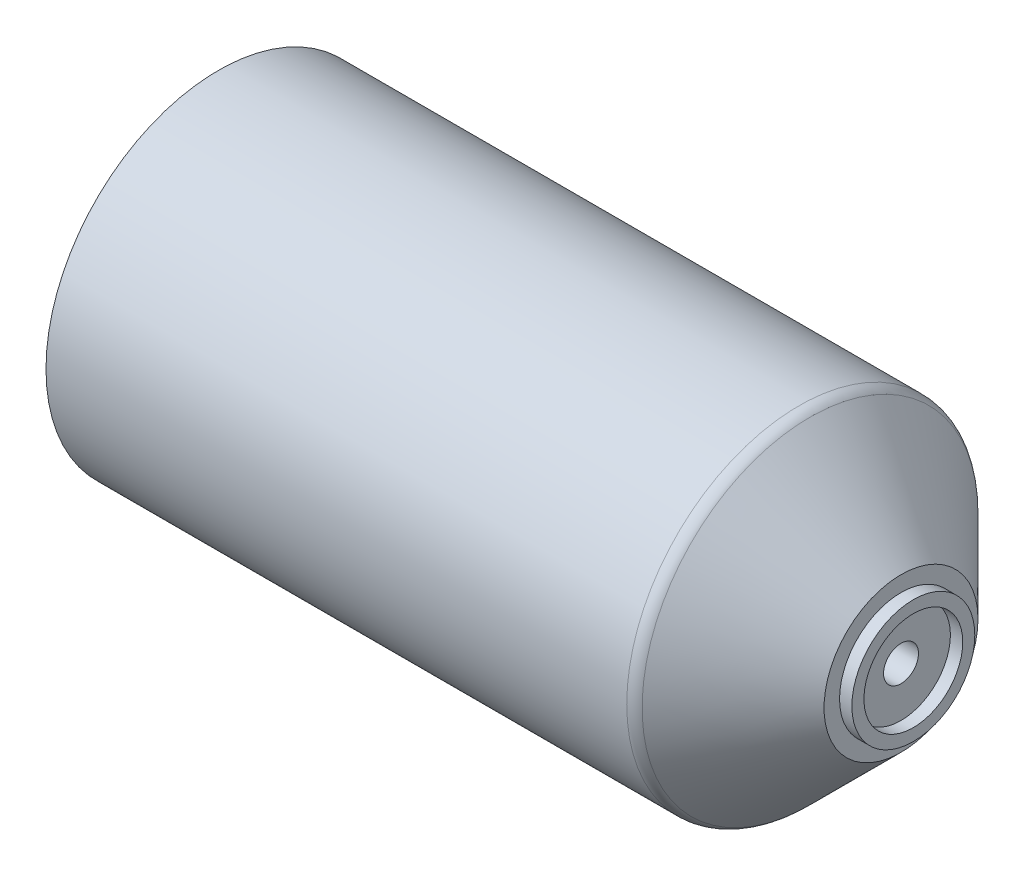
ISO-10303-21;
HEADER;
FILE_DESCRIPTION(('STEP AP214'),'2;1');
FILE_NAME('part.step','',(''),(''),'','','');
FILE_SCHEMA(('AUTOMOTIVE_DESIGN { 1 0 10303 214 1 1 1 1 }'));
ENDSEC;
DATA;
#1=APPLICATION_CONTEXT('core data for automotive mechanical design processes');
#2=APPLICATION_PROTOCOL_DEFINITION('international standard','automotive_design',2000,#1);
#3=PRODUCT_CONTEXT('',#1,'mechanical');
#4=PRODUCT('Part','Part','',(#3));
#5=PRODUCT_RELATED_PRODUCT_CATEGORY('part','',(#4));
#6=PRODUCT_DEFINITION_FORMATION('','',#4);
#7=PRODUCT_DEFINITION_CONTEXT('part definition',#1,'design');
#8=PRODUCT_DEFINITION('design','',#6,#7);
#9=PRODUCT_DEFINITION_SHAPE('','',#8);
#10=(LENGTH_UNIT() NAMED_UNIT(*) SI_UNIT(.MILLI.,.METRE.));
#11=(NAMED_UNIT(*) PLANE_ANGLE_UNIT() SI_UNIT($,.RADIAN.));
#12=(NAMED_UNIT(*) SI_UNIT($,.STERADIAN.) SOLID_ANGLE_UNIT());
#13=UNCERTAINTY_MEASURE_WITH_UNIT(LENGTH_MEASURE(1.E-05),#10,'distance_accuracy_value','');
#14=(GEOMETRIC_REPRESENTATION_CONTEXT(3) GLOBAL_UNCERTAINTY_ASSIGNED_CONTEXT((#13)) GLOBAL_UNIT_ASSIGNED_CONTEXT((#10,
#11,#12)) REPRESENTATION_CONTEXT('',''));
#15=CARTESIAN_POINT('',(0.,0.,0.));
#16=DIRECTION('',(0.,0.,1.));
#17=DIRECTION('',(1.,0.,0.));
#18=AXIS2_PLACEMENT_3D('',#15,#16,#17);
#19=CARTESIAN_POINT('',(-5.82137303331799,0.,0.));
#20=DIRECTION('',(-1.,0.,0.));
#21=DIRECTION('',(0.,0.,1.));
#22=AXIS2_PLACEMENT_3D('',#19,#20,#21);
#23=PLANE('',#22);
#24=CARTESIAN_POINT('',(-5.82137303331799,0.,0.));
#25=DIRECTION('',(-1.,0.,0.));
#26=DIRECTION('',(0.,0.,1.));
#27=AXIS2_PLACEMENT_3D('',#24,#25,#26);
#28=CIRCLE('',#27,1.8);
#29=CARTESIAN_POINT('',(-5.82137303331799,0.,1.8));
#30=VERTEX_POINT('',#29);
#31=EDGE_CURVE('E50',#30,#30,#28,.F.);
#32=ORIENTED_EDGE('',*,*,#31,.F.);
#33=EDGE_LOOP('',(#32));
#34=FACE_BOUND('',#33,.T.);
#35=CARTESIAN_POINT('',(-5.82137303331799,0.,0.));
#36=DIRECTION('',(1.,0.,0.));
#37=DIRECTION('',(0.,0.,-1.));
#38=AXIS2_PLACEMENT_3D('',#35,#36,#37);
#39=CIRCLE('',#38,5.0927);
#40=CARTESIAN_POINT('',(-5.82137303331799,0.,-5.0927));
#41=VERTEX_POINT('',#40);
#42=EDGE_CURVE('E105',#41,#41,#39,.T.);
#43=ORIENTED_EDGE('',*,*,#42,.T.);
#44=EDGE_LOOP('',(#43));
#45=FACE_BOUND('',#44,.T.);
#46=ADVANCED_FACE('F37',(#34,#45),#23,.F.);
#47=CARTESIAN_POINT('',(-5.82137303331799,0.,0.));
#48=DIRECTION('',(-1.,0.,0.));
#49=DIRECTION('',(0.,0.,1.));
#50=AXIS2_PLACEMENT_3D('',#47,#48,#49);
#51=CIRCLE('',#50,6.3373);
#52=CARTESIAN_POINT('',(-5.82137303331799,0.,6.3373));
#53=VERTEX_POINT('',#52);
#54=EDGE_CURVE('E10',#53,#53,#51,.F.);
#55=ORIENTED_EDGE('',*,*,#54,.F.);
#56=EDGE_LOOP('',(#55));
#57=FACE_BOUND('',#56,.T.);
#58=CARTESIAN_POINT('',(-5.82137303331799,0.,0.));
#59=DIRECTION('',(1.,0.,0.));
#60=DIRECTION('',(0.,0.,-1.));
#61=AXIS2_PLACEMENT_3D('',#58,#59,#60);
#62=CIRCLE('',#61,7.9375);
#63=CARTESIAN_POINT('',(-5.82137303331799,0.,-7.9375));
#64=VERTEX_POINT('',#63);
#65=EDGE_CURVE('E45',#64,#64,#62,.T.);
#66=ORIENTED_EDGE('',*,*,#65,.T.);
#67=EDGE_LOOP('',(#66));
#68=FACE_BOUND('',#67,.T.);
#69=ADVANCED_FACE('F39',(#57,#68),#23,.F.);
#70=CARTESIAN_POINT('',(-15.6638730333181,0.,0.));
#71=DIRECTION('',(-1.,0.,0.));
#72=DIRECTION('',(0.,0.,1.));
#73=AXIS2_PLACEMENT_3D('',#70,#71,#72);
#74=CYLINDRICAL_SURFACE('',#73,1.8);
#75=ORIENTED_EDGE('',*,*,#31,.T.);
#76=EDGE_LOOP('',(#75));
#77=FACE_BOUND('',#76,.T.);
#78=CARTESIAN_POINT('',(-14.0138730333181,0.,0.));
#79=DIRECTION('',(-1.,0.,0.));
#80=DIRECTION('',(0.,0.,1.));
#81=AXIS2_PLACEMENT_3D('',#78,#79,#80);
#82=CIRCLE('',#81,1.8);
#83=CARTESIAN_POINT('',(-14.0138730333181,0.,1.8));
#84=VERTEX_POINT('',#83);
#85=EDGE_CURVE('E129',#84,#84,#82,.T.);
#86=ORIENTED_EDGE('',*,*,#85,.T.);
#87=EDGE_LOOP('',(#86));
#88=FACE_BOUND('',#87,.T.);
#89=ADVANCED_FACE('F82',(#77,#88),#74,.F.);
#90=CARTESIAN_POINT('',(24.17211464598,0.,0.));
#91=DIRECTION('',(1.,0.,0.));
#92=DIRECTION('',(0.,0.,-1.));
#93=AXIS2_PLACEMENT_3D('',#90,#91,#92);
#94=CYLINDRICAL_SURFACE('',#93,11.43);
#95=CARTESIAN_POINT('',(-15.6638730333181,0.,0.));
#96=DIRECTION('',(1.,0.,0.));
#97=DIRECTION('',(0.,0.,-1.));
#98=AXIS2_PLACEMENT_3D('',#95,#96,#97);
#99=CIRCLE('',#98,11.43);
#100=CARTESIAN_POINT('',(-15.6638730333181,0.,-11.43));
#101=VERTEX_POINT('',#100);
#102=EDGE_CURVE('E59',#101,#101,#99,.T.);
#103=ORIENTED_EDGE('',*,*,#102,.T.);
#104=EDGE_LOOP('',(#103));
#105=FACE_BOUND('',#104,.T.);
#106=CARTESIAN_POINT('',(-76.2,0.,0.));
#107=DIRECTION('',(1.,0.,0.));
#108=DIRECTION('',(0.,0.,-1.));
#109=AXIS2_PLACEMENT_3D('',#106,#107,#108);
#110=CIRCLE('',#109,11.43);
#111=CARTESIAN_POINT('',(-76.2,0.,-11.43));
#112=VERTEX_POINT('',#111);
#113=EDGE_CURVE('E56',#112,#112,#110,.T.);
#114=ORIENTED_EDGE('',*,*,#113,.F.);
#115=EDGE_LOOP('',(#114));
#116=FACE_BOUND('',#115,.T.);
#117=ADVANCED_FACE('F80',(#105,#116),#94,.F.);
#118=CARTESIAN_POINT('',(-76.2,17.78,0.));
#119=DIRECTION('',(-1.,0.,0.));
#120=DIRECTION('',(0.,0.,1.));
#121=AXIS2_PLACEMENT_3D('',#118,#119,#120);
#122=PLANE('',#121);
#123=ORIENTED_EDGE('',*,*,#113,.T.);
#124=EDGE_LOOP('',(#123));
#125=FACE_BOUND('',#124,.T.);
#126=CARTESIAN_POINT('',(-76.2,0.,0.));
#127=DIRECTION('',(1.,0.,0.));
#128=DIRECTION('',(0.,0.,-1.));
#129=AXIS2_PLACEMENT_3D('',#126,#127,#128);
#130=CIRCLE('',#129,17.78);
#131=CARTESIAN_POINT('',(-76.2,0.,-17.78));
#132=VERTEX_POINT('',#131);
#133=EDGE_CURVE('E69',#132,#132,#130,.T.);
#134=ORIENTED_EDGE('',*,*,#133,.F.);
#135=EDGE_LOOP('',(#134));
#136=FACE_BOUND('',#135,.T.);
#137=ADVANCED_FACE('F77',(#125,#136),#122,.T.);
#138=CARTESIAN_POINT('',(24.17211464598,0.,0.));
#139=DIRECTION('',(1.,0.,0.));
#140=DIRECTION('',(0.,0.,-1.));
#141=AXIS2_PLACEMENT_3D('',#138,#139,#140);
#142=CYLINDRICAL_SURFACE('',#141,17.78);
#143=ORIENTED_EDGE('',*,*,#133,.T.);
#144=EDGE_LOOP('',(#143));
#145=FACE_BOUND('',#144,.T.);
#146=CARTESIAN_POINT('',(-16.3214370635854,0.,0.));
#147=DIRECTION('',(1.,0.,0.));
#148=DIRECTION('',(0.,0.,-1.));
#149=AXIS2_PLACEMENT_3D('',#146,#147,#148);
#150=CIRCLE('',#149,17.78);
#151=CARTESIAN_POINT('',(-16.3214370635854,0.,-17.78));
#152=VERTEX_POINT('',#151);
#153=EDGE_CURVE('E65',#152,#152,#150,.T.);
#154=ORIENTED_EDGE('',*,*,#153,.F.);
#155=EDGE_LOOP('',(#154));
#156=FACE_BOUND('',#155,.T.);
#157=ADVANCED_FACE('F88',(#145,#156),#142,.T.);
#158=CARTESIAN_POINT('',(-16.3214370635854,0.,0.));
#159=DIRECTION('',(1.,0.,0.));
#160=DIRECTION('',(0.,0.,-1.));
#161=AXIS2_PLACEMENT_3D('',#158,#159,#160);
#162=TOROIDAL_SURFACE('',#161,16.1925,1.58749999999999);
#163=ORIENTED_EDGE('',*,*,#153,.T.);
#164=EDGE_LOOP('',(#163));
#165=FACE_BOUND('',#164,.T.);
#166=CARTESIAN_POINT('',(-15.1989050484517,0.,0.));
#167=DIRECTION('',(1.,0.,0.));
#168=DIRECTION('',(0.,0.,-1.));
#169=AXIS2_PLACEMENT_3D('',#166,#167,#168);
#170=CIRCLE('',#169,17.3150320151336);
#171=CARTESIAN_POINT('',(-15.1989050484517,0.,-17.3150320151336));
#172=VERTEX_POINT('',#171);
#173=EDGE_CURVE('E61',#172,#172,#170,.T.);
#174=ORIENTED_EDGE('',*,*,#173,.F.);
#175=EDGE_LOOP('',(#174));
#176=FACE_BOUND('',#175,.T.);
#177=ADVANCED_FACE('F150',(#165,#176),#162,.T.);
#178=CARTESIAN_POINT('',(-5.82137303331799,0.,0.));
#179=DIRECTION('',(-1.,0.,0.));
#180=DIRECTION('',(0.,0.,1.));
#181=AXIS2_PLACEMENT_3D('',#178,#179,#180);
#182=CONICAL_SURFACE('',#181,7.9375,0.785398163397442);
#183=ORIENTED_EDGE('',*,*,#173,.T.);
#184=EDGE_LOOP('',(#183));
#185=FACE_BOUND('',#184,.T.);
#186=ORIENTED_EDGE('',*,*,#65,.F.);
#187=EDGE_LOOP('',(#186));
#188=FACE_BOUND('',#187,.T.);
#189=ADVANCED_FACE('F140',(#185,#188),#182,.T.);
#190=CARTESIAN_POINT('',(-15.6638730333181,11.43,0.));
#191=DIRECTION('',(-1.,0.,0.));
#192=DIRECTION('',(0.,0.,1.));
#193=AXIS2_PLACEMENT_3D('',#190,#191,#192);
#194=PLANE('',#193);
#195=CARTESIAN_POINT('',(-15.6638730333181,0.,0.));
#196=DIRECTION('',(-1.,0.,0.));
#197=DIRECTION('',(0.,0.,1.));
#198=AXIS2_PLACEMENT_3D('',#195,#196,#197);
#199=CIRCLE('',#198,3.375);
#200=CARTESIAN_POINT('',(-15.6638730333181,0.,3.375));
#201=VERTEX_POINT('',#200);
#202=EDGE_CURVE('E118',#201,#201,#199,.T.);
#203=ORIENTED_EDGE('',*,*,#202,.F.);
#204=EDGE_LOOP('',(#203));
#205=FACE_BOUND('',#204,.T.);
#206=ORIENTED_EDGE('',*,*,#102,.F.);
#207=EDGE_LOOP('',(#206));
#208=FACE_BOUND('',#207,.T.);
#209=ADVANCED_FACE('F137',(#205,#208),#194,.T.);
#210=CARTESIAN_POINT('',(-14.0138730333181,3.35,0.));
#211=DIRECTION('',(1.,0.,0.));
#212=DIRECTION('',(0.,0.,-1.));
#213=AXIS2_PLACEMENT_3D('',#210,#211,#212);
#214=PLANE('',#213);
#215=ORIENTED_EDGE('',*,*,#85,.F.);
#216=EDGE_LOOP('',(#215));
#217=FACE_BOUND('',#216,.T.);
#218=CARTESIAN_POINT('',(-14.0138730333181,0.,0.));
#219=DIRECTION('',(-1.,0.,0.));
#220=DIRECTION('',(0.,0.,1.));
#221=AXIS2_PLACEMENT_3D('',#218,#219,#220);
#222=CIRCLE('',#221,3.35);
#223=CARTESIAN_POINT('',(-14.0138730333181,0.,3.35));
#224=VERTEX_POINT('',#223);
#225=EDGE_CURVE('E126',#224,#224,#222,.T.);
#226=ORIENTED_EDGE('',*,*,#225,.T.);
#227=EDGE_LOOP('',(#226));
#228=FACE_BOUND('',#227,.T.);
#229=ADVANCED_FACE('F139',(#217,#228),#214,.F.);
#230=CARTESIAN_POINT('',(-15.6638730333181,0.,0.));
#231=DIRECTION('',(-1.,0.,0.));
#232=DIRECTION('',(0.,0.,1.));
#233=AXIS2_PLACEMENT_3D('',#230,#231,#232);
#234=CYLINDRICAL_SURFACE('',#233,3.35);
#235=ORIENTED_EDGE('',*,*,#225,.F.);
#236=EDGE_LOOP('',(#235));
#237=FACE_BOUND('',#236,.T.);
#238=CARTESIAN_POINT('',(-15.6388730333181,0.,0.));
#239=DIRECTION('',(-1.,0.,0.));
#240=DIRECTION('',(0.,0.,1.));
#241=AXIS2_PLACEMENT_3D('',#238,#239,#240);
#242=CIRCLE('',#241,3.35);
#243=CARTESIAN_POINT('',(-15.6388730333181,0.,3.35));
#244=VERTEX_POINT('',#243);
#245=EDGE_CURVE('E122',#244,#244,#242,.T.);
#246=ORIENTED_EDGE('',*,*,#245,.T.);
#247=EDGE_LOOP('',(#246));
#248=FACE_BOUND('',#247,.T.);
#249=ADVANCED_FACE('F147',(#237,#248),#234,.F.);
#250=CARTESIAN_POINT('',(-15.6638730333181,0.,0.));
#251=DIRECTION('',(-1.,0.,0.));
#252=DIRECTION('',(0.,0.,1.));
#253=AXIS2_PLACEMENT_3D('',#250,#251,#252);
#254=CONICAL_SURFACE('',#253,3.375,0.785398163397405);
#255=ORIENTED_EDGE('',*,*,#245,.F.);
#256=EDGE_LOOP('',(#255));
#257=FACE_BOUND('',#256,.T.);
#258=ORIENTED_EDGE('',*,*,#202,.T.);
#259=EDGE_LOOP('',(#258));
#260=FACE_BOUND('',#259,.T.);
#261=ADVANCED_FACE('F100',(#257,#260),#254,.F.);
#262=CARTESIAN_POINT('',(-4.55137303331799,0.,0.));
#263=DIRECTION('',(1.,0.,0.));
#264=DIRECTION('',(0.,0.,-1.));
#265=AXIS2_PLACEMENT_3D('',#262,#263,#264);
#266=PLANE('',#265);
#267=CARTESIAN_POINT('',(-4.55137303331799,0.,0.));
#268=DIRECTION('',(1.,0.,0.));
#269=DIRECTION('',(0.,0.,-1.));
#270=AXIS2_PLACEMENT_3D('',#267,#268,#269);
#271=CIRCLE('',#270,6.3373);
#272=CARTESIAN_POINT('',(-4.55137303331799,0.,-6.3373));
#273=VERTEX_POINT('',#272);
#274=EDGE_CURVE('E112',#273,#273,#271,.T.);
#275=ORIENTED_EDGE('',*,*,#274,.T.);
#276=EDGE_LOOP('',(#275));
#277=FACE_BOUND('',#276,.T.);
#278=CARTESIAN_POINT('',(-4.55137303331799,0.,0.));
#279=DIRECTION('',(1.,0.,0.));
#280=DIRECTION('',(0.,0.,-1.));
#281=AXIS2_PLACEMENT_3D('',#278,#279,#280);
#282=CIRCLE('',#281,5.0927);
#283=CARTESIAN_POINT('',(-4.55137303331799,0.,-5.0927));
#284=VERTEX_POINT('',#283);
#285=EDGE_CURVE('E108',#284,#284,#282,.T.);
#286=ORIENTED_EDGE('',*,*,#285,.F.);
#287=EDGE_LOOP('',(#286));
#288=FACE_BOUND('',#287,.T.);
#289=ADVANCED_FACE('F92',(#277,#288),#266,.T.);
#290=CARTESIAN_POINT('',(-4.55137303331799,0.,0.));
#291=DIRECTION('',(-1.,0.,0.));
#292=DIRECTION('',(0.,0.,1.));
#293=AXIS2_PLACEMENT_3D('',#290,#291,#292);
#294=CYLINDRICAL_SURFACE('',#293,6.3373);
#295=ORIENTED_EDGE('',*,*,#274,.F.);
#296=EDGE_LOOP('',(#295));
#297=FACE_BOUND('',#296,.T.);
#298=ORIENTED_EDGE('',*,*,#54,.T.);
#299=EDGE_LOOP('',(#298));
#300=FACE_BOUND('',#299,.T.);
#301=ADVANCED_FACE('F204',(#297,#300),#294,.T.);
#302=CARTESIAN_POINT('',(-4.55137303331799,0.,0.));
#303=DIRECTION('',(-1.,0.,0.));
#304=DIRECTION('',(0.,0.,1.));
#305=AXIS2_PLACEMENT_3D('',#302,#303,#304);
#306=CYLINDRICAL_SURFACE('',#305,5.0927);
#307=ORIENTED_EDGE('',*,*,#285,.T.);
#308=EDGE_LOOP('',(#307));
#309=FACE_BOUND('',#308,.T.);
#310=ORIENTED_EDGE('',*,*,#42,.F.);
#311=EDGE_LOOP('',(#310));
#312=FACE_BOUND('',#311,.T.);
#313=ADVANCED_FACE('F215',(#309,#312),#306,.F.);
#314=CLOSED_SHELL('',(#46,#69,#89,#117,#137,#157,#177,#189,#209,#229,#249,#261,#289,#301,#313));
#315=MANIFOLD_SOLID_BREP('B2',#314);
#316=ADVANCED_BREP_SHAPE_REPRESENTATION('',(#18,#315),#14);
#317=SHAPE_DEFINITION_REPRESENTATION(#9,#316);
ENDSEC;
END-ISO-10303-21;
